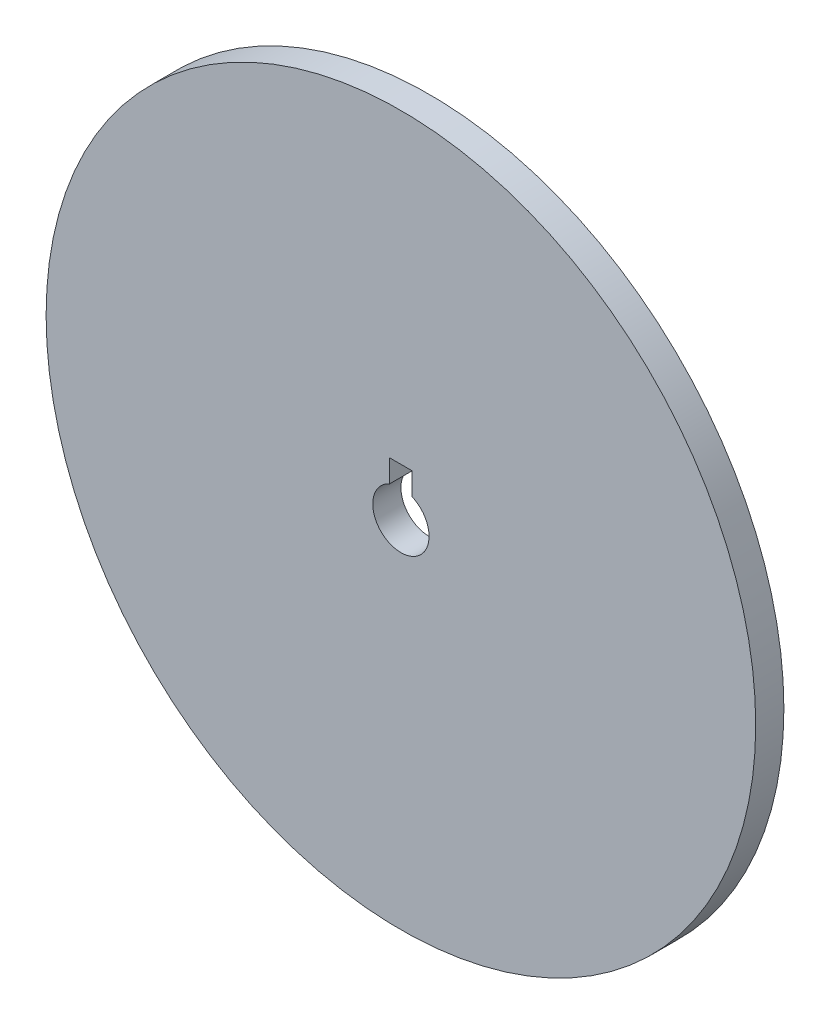
ISO-10303-21;
HEADER;
FILE_DESCRIPTION(('STEP AP214'),'2;1');
FILE_NAME('part.step','',(''),(''),'','','');
FILE_SCHEMA(('AUTOMOTIVE_DESIGN { 1 0 10303 214 1 1 1 1 }'));
ENDSEC;
DATA;
#1=APPLICATION_CONTEXT('core data for automotive mechanical design processes');
#2=APPLICATION_PROTOCOL_DEFINITION('international standard','automotive_design',2000,#1);
#3=PRODUCT_CONTEXT('',#1,'mechanical');
#4=PRODUCT('Part','Part','',(#3));
#5=PRODUCT_RELATED_PRODUCT_CATEGORY('part','',(#4));
#6=PRODUCT_DEFINITION_FORMATION('','',#4);
#7=PRODUCT_DEFINITION_CONTEXT('part definition',#1,'design');
#8=PRODUCT_DEFINITION('design','',#6,#7);
#9=PRODUCT_DEFINITION_SHAPE('','',#8);
#10=(LENGTH_UNIT() NAMED_UNIT(*) SI_UNIT(.MILLI.,.METRE.));
#11=(NAMED_UNIT(*) PLANE_ANGLE_UNIT() SI_UNIT($,.RADIAN.));
#12=(NAMED_UNIT(*) SI_UNIT($,.STERADIAN.) SOLID_ANGLE_UNIT());
#13=UNCERTAINTY_MEASURE_WITH_UNIT(LENGTH_MEASURE(1.E-05),#10,'distance_accuracy_value','');
#14=(GEOMETRIC_REPRESENTATION_CONTEXT(3) GLOBAL_UNCERTAINTY_ASSIGNED_CONTEXT((#13)) GLOBAL_UNIT_ASSIGNED_CONTEXT((#10,
#11,#12)) REPRESENTATION_CONTEXT('',''));
#15=CARTESIAN_POINT('',(0.,0.,0.));
#16=DIRECTION('',(0.,0.,1.));
#17=DIRECTION('',(1.,0.,0.));
#18=AXIS2_PLACEMENT_3D('',#15,#16,#17);
#19=CARTESIAN_POINT('',(0.,0.,5.));
#20=DIRECTION('',(0.,0.,-1.));
#21=DIRECTION('',(-1.,0.,0.));
#22=AXIS2_PLACEMENT_3D('',#19,#20,#21);
#23=CYLINDRICAL_SURFACE('',#22,63.);
#24=CARTESIAN_POINT('',(0.,0.,5.));
#25=DIRECTION('',(0.,0.,1.));
#26=DIRECTION('',(1.,0.,0.));
#27=AXIS2_PLACEMENT_3D('',#24,#25,#26);
#28=CIRCLE('',#27,63.);
#29=CARTESIAN_POINT('',(63.,0.,5.));
#30=VERTEX_POINT('',#29);
#31=EDGE_CURVE('E78',#30,#30,#28,.T.);
#32=ORIENTED_EDGE('',*,*,#31,.F.);
#33=EDGE_LOOP('',(#32));
#34=FACE_BOUND('',#33,.T.);
#35=CARTESIAN_POINT('',(0.,0.,0.));
#36=DIRECTION('',(0.,0.,1.));
#37=DIRECTION('',(1.,0.,0.));
#38=AXIS2_PLACEMENT_3D('',#35,#36,#37);
#39=CIRCLE('',#38,63.);
#40=CARTESIAN_POINT('',(63.,0.,0.));
#41=VERTEX_POINT('',#40);
#42=EDGE_CURVE('E89',#41,#41,#39,.T.);
#43=ORIENTED_EDGE('',*,*,#42,.T.);
#44=EDGE_LOOP('',(#43));
#45=FACE_BOUND('',#44,.T.);
#46=ADVANCED_FACE('F33',(#34,#45),#23,.T.);
#47=CARTESIAN_POINT('',(0.,0.,5.));
#48=DIRECTION('',(0.,0.,1.));
#49=DIRECTION('',(1.,0.,0.));
#50=AXIS2_PLACEMENT_3D('',#47,#48,#49);
#51=PLANE('',#50);
#52=DIRECTION('',(0.,1.,0.));
#53=VECTOR('',#52,1.);
#54=CARTESIAN_POINT('',(2.,0.,5.));
#55=LINE('',#54,#53);
#56=CARTESIAN_POINT('',(2.,4.58257569495584,5.));
#57=VERTEX_POINT('',#56);
#58=CARTESIAN_POINT('',(2.,8.58257569495584,5.));
#59=VERTEX_POINT('',#58);
#60=EDGE_CURVE('E101',#57,#59,#55,.T.);
#61=ORIENTED_EDGE('',*,*,#60,.F.);
#62=CARTESIAN_POINT('',(0.,0.,5.));
#63=DIRECTION('',(0.,0.,1.));
#64=DIRECTION('',(1.,0.,0.));
#65=AXIS2_PLACEMENT_3D('',#62,#63,#64);
#66=CIRCLE('',#65,5.);
#67=CARTESIAN_POINT('',(-2.,4.58257569495584,5.));
#68=VERTEX_POINT('',#67);
#69=EDGE_CURVE('E90',#68,#57,#66,.T.);
#70=ORIENTED_EDGE('',*,*,#69,.F.);
#71=DIRECTION('',(0.,1.,0.));
#72=VECTOR('',#71,1.);
#73=CARTESIAN_POINT('',(-2.,0.,5.));
#74=LINE('',#73,#72);
#75=CARTESIAN_POINT('',(-2.,8.58257569495584,5.));
#76=VERTEX_POINT('',#75);
#77=EDGE_CURVE('E47',#68,#76,#74,.T.);
#78=ORIENTED_EDGE('',*,*,#77,.T.);
#79=DIRECTION('',(1.,0.,0.));
#80=VECTOR('',#79,1.);
#81=CARTESIAN_POINT('',(0.,8.58257569495584,5.));
#82=LINE('',#81,#80);
#83=EDGE_CURVE('E94',#76,#59,#82,.T.);
#84=ORIENTED_EDGE('',*,*,#83,.T.);
#85=EDGE_LOOP('',(#61,#70,#78,#84));
#86=FACE_BOUND('',#85,.T.);
#87=ORIENTED_EDGE('',*,*,#31,.T.);
#88=EDGE_LOOP('',(#87));
#89=FACE_BOUND('',#88,.T.);
#90=ADVANCED_FACE('F115',(#86,#89),#51,.T.);
#91=CARTESIAN_POINT('',(0.,0.,0.));
#92=DIRECTION('',(0.,0.,1.));
#93=DIRECTION('',(1.,0.,0.));
#94=AXIS2_PLACEMENT_3D('',#91,#92,#93);
#95=PLANE('',#94);
#96=CARTESIAN_POINT('',(0.,0.,0.));
#97=DIRECTION('',(0.,0.,1.));
#98=DIRECTION('',(1.,0.,0.));
#99=AXIS2_PLACEMENT_3D('',#96,#97,#98);
#100=CIRCLE('',#99,5.);
#101=CARTESIAN_POINT('',(-2.,4.58257569495584,0.));
#102=VERTEX_POINT('',#101);
#103=CARTESIAN_POINT('',(2.,4.58257569495584,0.));
#104=VERTEX_POINT('',#103);
#105=EDGE_CURVE('E84',#102,#104,#100,.T.);
#106=ORIENTED_EDGE('',*,*,#105,.T.);
#107=DIRECTION('',(0.,-1.,0.));
#108=VECTOR('',#107,1.);
#109=CARTESIAN_POINT('',(2.,8.58257569495584,0.));
#110=LINE('',#109,#108);
#111=CARTESIAN_POINT('',(2.,8.58257569495584,0.));
#112=VERTEX_POINT('',#111);
#113=EDGE_CURVE('E107',#112,#104,#110,.T.);
#114=ORIENTED_EDGE('',*,*,#113,.F.);
#115=DIRECTION('',(-1.,0.,0.));
#116=VECTOR('',#115,1.);
#117=CARTESIAN_POINT('',(2.,8.58257569495584,0.));
#118=LINE('',#117,#116);
#119=CARTESIAN_POINT('',(-2.,8.58257569495584,0.));
#120=VERTEX_POINT('',#119);
#121=EDGE_CURVE('E86',#112,#120,#118,.T.);
#122=ORIENTED_EDGE('',*,*,#121,.T.);
#123=DIRECTION('',(0.,-1.,0.));
#124=VECTOR('',#123,1.);
#125=CARTESIAN_POINT('',(-2.,8.58257569495584,0.));
#126=LINE('',#125,#124);
#127=EDGE_CURVE('E72',#120,#102,#126,.T.);
#128=ORIENTED_EDGE('',*,*,#127,.T.);
#129=EDGE_LOOP('',(#106,#114,#122,#128));
#130=FACE_BOUND('',#129,.T.);
#131=ORIENTED_EDGE('',*,*,#42,.F.);
#132=EDGE_LOOP('',(#131));
#133=FACE_BOUND('',#132,.T.);
#134=ADVANCED_FACE('F81',(#130,#133),#95,.F.);
#135=CARTESIAN_POINT('',(0.,0.,-5.));
#136=DIRECTION('',(0.,0.,1.));
#137=DIRECTION('',(1.,0.,0.));
#138=AXIS2_PLACEMENT_3D('',#135,#136,#137);
#139=CYLINDRICAL_SURFACE('',#138,5.);
#140=ORIENTED_EDGE('',*,*,#69,.T.);
#141=DIRECTION('',(0.,0.,1.));
#142=VECTOR('',#141,1.);
#143=CARTESIAN_POINT('',(2.,4.58257569495584,-5.));
#144=LINE('',#143,#142);
#145=EDGE_CURVE('E11',#57,#104,#144,.F.);
#146=ORIENTED_EDGE('',*,*,#145,.T.);
#147=ORIENTED_EDGE('',*,*,#105,.F.);
#148=DIRECTION('',(0.,0.,1.));
#149=VECTOR('',#148,1.);
#150=CARTESIAN_POINT('',(-2.,4.58257569495584,-5.));
#151=LINE('',#150,#149);
#152=EDGE_CURVE('E40',#68,#102,#151,.F.);
#153=ORIENTED_EDGE('',*,*,#152,.F.);
#154=EDGE_LOOP('',(#140,#146,#147,#153));
#155=FACE_BOUND('',#154,.T.);
#156=ADVANCED_FACE('F88',(#155),#139,.F.);
#157=CARTESIAN_POINT('',(2.,8.58257569495584,8.));
#158=DIRECTION('',(1.,0.,0.));
#159=DIRECTION('',(0.,1.,0.));
#160=AXIS2_PLACEMENT_3D('',#157,#158,#159);
#161=PLANE('',#160);
#162=ORIENTED_EDGE('',*,*,#60,.T.);
#163=DIRECTION('',(0.,0.,-1.));
#164=VECTOR('',#163,1.);
#165=CARTESIAN_POINT('',(2.,8.58257569495584,8.));
#166=LINE('',#165,#164);
#167=EDGE_CURVE('E104',#59,#112,#166,.T.);
#168=ORIENTED_EDGE('',*,*,#167,.T.);
#169=ORIENTED_EDGE('',*,*,#113,.T.);
#170=ORIENTED_EDGE('',*,*,#145,.F.);
#171=EDGE_LOOP('',(#162,#168,#169,#170));
#172=FACE_BOUND('',#171,.T.);
#173=ADVANCED_FACE('F110',(#172),#161,.F.);
#174=CARTESIAN_POINT('',(2.,8.58257569495584,8.));
#175=DIRECTION('',(0.,-1.,0.));
#176=DIRECTION('',(0.,0.,-1.));
#177=AXIS2_PLACEMENT_3D('',#174,#175,#176);
#178=PLANE('',#177);
#179=DIRECTION('',(0.,0.,-1.));
#180=VECTOR('',#179,1.);
#181=CARTESIAN_POINT('',(-2.,8.58257569495584,8.));
#182=LINE('',#181,#180);
#183=EDGE_CURVE('E105',#76,#120,#182,.T.);
#184=ORIENTED_EDGE('',*,*,#183,.T.);
#185=ORIENTED_EDGE('',*,*,#121,.F.);
#186=ORIENTED_EDGE('',*,*,#167,.F.);
#187=ORIENTED_EDGE('',*,*,#83,.F.);
#188=EDGE_LOOP('',(#184,#185,#186,#187));
#189=FACE_BOUND('',#188,.T.);
#190=ADVANCED_FACE('F113',(#189),#178,.T.);
#191=CARTESIAN_POINT('',(-2.,8.58257569495584,8.));
#192=DIRECTION('',(1.,0.,0.));
#193=DIRECTION('',(0.,0.,-1.));
#194=AXIS2_PLACEMENT_3D('',#191,#192,#193);
#195=PLANE('',#194);
#196=ORIENTED_EDGE('',*,*,#152,.T.);
#197=ORIENTED_EDGE('',*,*,#127,.F.);
#198=ORIENTED_EDGE('',*,*,#183,.F.);
#199=ORIENTED_EDGE('',*,*,#77,.F.);
#200=EDGE_LOOP('',(#196,#197,#198,#199));
#201=FACE_BOUND('',#200,.T.);
#202=ADVANCED_FACE('F71',(#201),#195,.T.);
#203=CLOSED_SHELL('',(#46,#90,#134,#156,#173,#190,#202));
#204=MANIFOLD_SOLID_BREP('B2',#203);
#205=ADVANCED_BREP_SHAPE_REPRESENTATION('',(#18,#204),#14);
#206=SHAPE_DEFINITION_REPRESENTATION(#9,#205);
ENDSEC;
END-ISO-10303-21;
